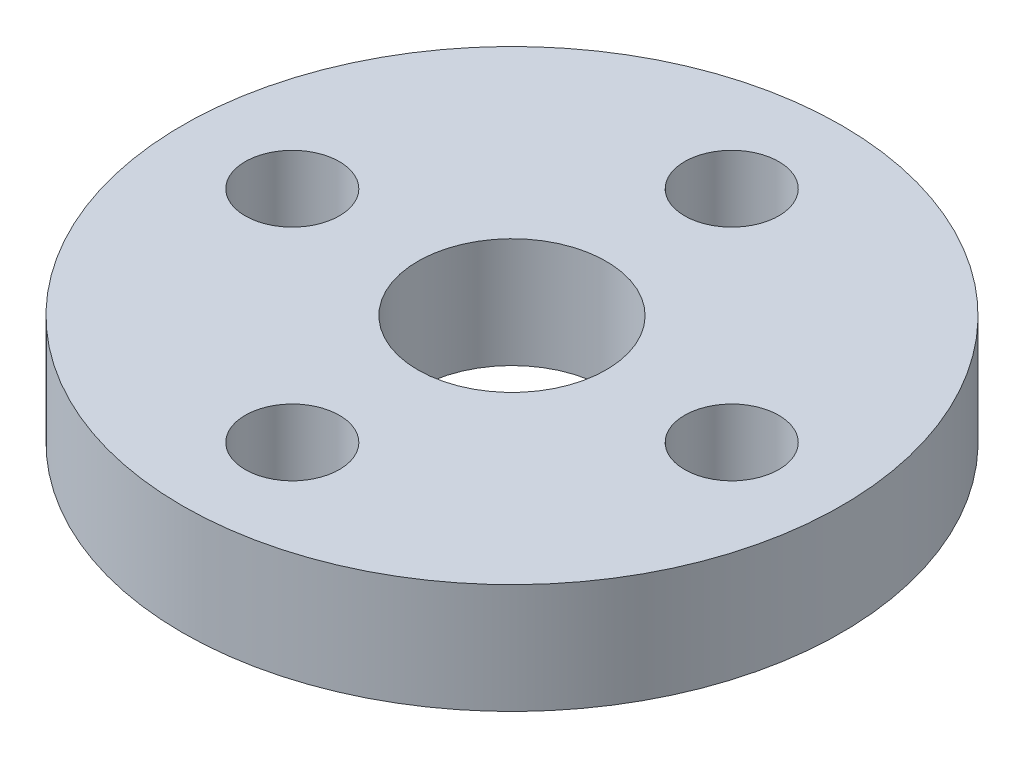
ISO-10303-21;
HEADER;
FILE_DESCRIPTION(('STEP AP214'),'2;1');
FILE_NAME('part.step','',(''),(''),'','','');
FILE_SCHEMA(('AUTOMOTIVE_DESIGN { 1 0 10303 214 1 1 1 1 }'));
ENDSEC;
DATA;
#1=APPLICATION_CONTEXT('core data for automotive mechanical design processes');
#2=APPLICATION_PROTOCOL_DEFINITION('international standard','automotive_design',2000,#1);
#3=PRODUCT_CONTEXT('',#1,'mechanical');
#4=PRODUCT('Part','Part','',(#3));
#5=PRODUCT_RELATED_PRODUCT_CATEGORY('part','',(#4));
#6=PRODUCT_DEFINITION_FORMATION('','',#4);
#7=PRODUCT_DEFINITION_CONTEXT('part definition',#1,'design');
#8=PRODUCT_DEFINITION('design','',#6,#7);
#9=PRODUCT_DEFINITION_SHAPE('','',#8);
#10=(LENGTH_UNIT() NAMED_UNIT(*) SI_UNIT(.MILLI.,.METRE.));
#11=(NAMED_UNIT(*) PLANE_ANGLE_UNIT() SI_UNIT($,.RADIAN.));
#12=(NAMED_UNIT(*) SI_UNIT($,.STERADIAN.) SOLID_ANGLE_UNIT());
#13=UNCERTAINTY_MEASURE_WITH_UNIT(LENGTH_MEASURE(1.E-05),#10,'distance_accuracy_value','');
#14=(GEOMETRIC_REPRESENTATION_CONTEXT(3) GLOBAL_UNCERTAINTY_ASSIGNED_CONTEXT((#13)) GLOBAL_UNIT_ASSIGNED_CONTEXT((#10,
#11,#12)) REPRESENTATION_CONTEXT('',''));
#15=CARTESIAN_POINT('',(0.,0.,0.));
#16=DIRECTION('',(0.,0.,1.));
#17=DIRECTION('',(1.,0.,0.));
#18=AXIS2_PLACEMENT_3D('',#15,#16,#17);
#19=CARTESIAN_POINT('',(0.,3.5,0.));
#20=DIRECTION('',(0.,-1.,0.));
#21=DIRECTION('',(0.,0.,-1.));
#22=AXIS2_PLACEMENT_3D('',#19,#20,#21);
#23=CYLINDRICAL_SURFACE('',#22,10.5);
#24=CARTESIAN_POINT('',(0.,3.5,0.));
#25=DIRECTION('',(0.,1.,0.));
#26=DIRECTION('',(0.,0.,1.));
#27=AXIS2_PLACEMENT_3D('',#24,#25,#26);
#28=CIRCLE('',#27,10.5);
#29=CARTESIAN_POINT('',(0.,3.5,-10.5));
#30=VERTEX_POINT('',#29);
#31=EDGE_CURVE('E10',#30,#30,#28,.T.);
#32=CARTESIAN_POINT('',(0.,0.,0.));
#33=DIRECTION('',(0.,1.,0.));
#34=DIRECTION('',(0.,0.,1.));
#35=AXIS2_PLACEMENT_3D('',#32,#33,#34);
#36=CIRCLE('',#35,10.5);
#37=CARTESIAN_POINT('',(0.,0.,-10.5));
#38=VERTEX_POINT('',#37);
#39=EDGE_CURVE('E42',#38,#38,#36,.T.);
#40=CARTESIAN_POINT('',(0.,3.5,-10.5));
#41=CARTESIAN_POINT('',(0.,3.46354166666667,-10.5));
#42=CARTESIAN_POINT('',(0.,3.42708333333333,-10.5));
#43=CARTESIAN_POINT('',(0.,3.35416666666667,-10.5));
#44=CARTESIAN_POINT('',(0.,3.31770833333333,-10.5));
#45=CARTESIAN_POINT('',(0.,3.24479166666667,-10.5));
#46=CARTESIAN_POINT('',(0.,3.20833333333333,-10.5));
#47=CARTESIAN_POINT('',(0.,3.13541666666667,-10.5));
#48=CARTESIAN_POINT('',(0.,3.09895833333333,-10.5));
#49=CARTESIAN_POINT('',(0.,3.02604166666667,-10.5));
#50=CARTESIAN_POINT('',(0.,2.98958333333333,-10.5));
#51=CARTESIAN_POINT('',(0.,2.91666666666667,-10.5));
#52=CARTESIAN_POINT('',(0.,2.88020833333333,-10.5));
#53=CARTESIAN_POINT('',(0.,2.80729166666667,-10.5));
#54=CARTESIAN_POINT('',(0.,2.77083333333333,-10.5));
#55=CARTESIAN_POINT('',(0.,2.69791666666667,-10.5));
#56=CARTESIAN_POINT('',(0.,2.66145833333333,-10.5));
#57=CARTESIAN_POINT('',(0.,2.58854166666667,-10.5));
#58=CARTESIAN_POINT('',(0.,2.55208333333333,-10.5));
#59=CARTESIAN_POINT('',(0.,2.47916666666667,-10.5));
#60=CARTESIAN_POINT('',(0.,2.44270833333333,-10.5));
#61=CARTESIAN_POINT('',(0.,2.36979166666667,-10.5));
#62=CARTESIAN_POINT('',(0.,2.33333333333333,-10.5));
#63=CARTESIAN_POINT('',(0.,2.26041666666667,-10.5));
#64=CARTESIAN_POINT('',(0.,2.22395833333333,-10.5));
#65=CARTESIAN_POINT('',(0.,2.15104166666667,-10.5));
#66=CARTESIAN_POINT('',(0.,2.11458333333333,-10.5));
#67=CARTESIAN_POINT('',(0.,2.04166666666667,-10.5));
#68=CARTESIAN_POINT('',(0.,2.00520833333333,-10.5));
#69=CARTESIAN_POINT('',(0.,1.93229166666667,-10.5));
#70=CARTESIAN_POINT('',(0.,1.89583333333333,-10.5));
#71=CARTESIAN_POINT('',(0.,1.82291666666667,-10.5));
#72=CARTESIAN_POINT('',(0.,1.78645833333333,-10.5));
#73=CARTESIAN_POINT('',(0.,1.71354166666667,-10.5));
#74=CARTESIAN_POINT('',(0.,1.67708333333333,-10.5));
#75=CARTESIAN_POINT('',(0.,1.60416666666667,-10.5));
#76=CARTESIAN_POINT('',(0.,1.56770833333333,-10.5));
#77=CARTESIAN_POINT('',(0.,1.49479166666667,-10.5));
#78=CARTESIAN_POINT('',(0.,1.45833333333333,-10.5));
#79=CARTESIAN_POINT('',(0.,1.38541666666667,-10.5));
#80=CARTESIAN_POINT('',(0.,1.34895833333333,-10.5));
#81=CARTESIAN_POINT('',(0.,1.27604166666667,-10.5));
#82=CARTESIAN_POINT('',(0.,1.23958333333333,-10.5));
#83=CARTESIAN_POINT('',(0.,1.16666666666667,-10.5));
#84=CARTESIAN_POINT('',(0.,1.13020833333333,-10.5));
#85=CARTESIAN_POINT('',(0.,1.05729166666667,-10.5));
#86=CARTESIAN_POINT('',(0.,1.02083333333333,-10.5));
#87=CARTESIAN_POINT('',(0.,0.947916666666666,-10.5));
#88=CARTESIAN_POINT('',(0.,0.911458333333333,-10.5));
#89=CARTESIAN_POINT('',(0.,0.838541666666666,-10.5));
#90=CARTESIAN_POINT('',(0.,0.802083333333333,-10.5));
#91=CARTESIAN_POINT('',(0.,0.729166666666667,-10.5));
#92=CARTESIAN_POINT('',(0.,0.692708333333333,-10.5));
#93=CARTESIAN_POINT('',(0.,0.619791666666666,-10.5));
#94=CARTESIAN_POINT('',(0.,0.583333333333333,-10.5));
#95=CARTESIAN_POINT('',(0.,0.510416666666666,-10.5));
#96=CARTESIAN_POINT('',(0.,0.473958333333333,-10.5));
#97=CARTESIAN_POINT('',(0.,0.401041666666666,-10.5));
#98=CARTESIAN_POINT('',(0.,0.364583333333333,-10.5));
#99=CARTESIAN_POINT('',(0.,0.291666666666666,-10.5));
#100=CARTESIAN_POINT('',(0.,0.255208333333333,-10.5));
#101=CARTESIAN_POINT('',(0.,0.182291666666666,-10.5));
#102=CARTESIAN_POINT('',(0.,0.145833333333333,-10.5));
#103=CARTESIAN_POINT('',(0.,0.0729166666666663,-10.5));
#104=CARTESIAN_POINT('',(0.,0.0364583333333329,-10.5));
#105=CARTESIAN_POINT('',(0.,0.,-10.5));
#106=B_SPLINE_CURVE_WITH_KNOTS('',3,(#40,#41,#42,#43,#44,#45,#46,#47,#48,#49,#50,#51,#52,#53,
#54,#55,#56,#57,#58,#59,#60,#61,#62,#63,#64,#65,#66,#67,#68,#69,#70,#71,#72,#73,#74,#75,#76,#77,
#78,#79,#80,#81,#82,#83,#84,#85,#86,#87,#88,#89,#90,#91,#92,#93,#94,#95,#96,#97,#98,#99,#100,
#101,#102,#103,#104,#105),.UNSPECIFIED.,.F.,.F.,(4,2,2,2,2,2,2,2,2,2,2,2,2,2,2,2,2,2,2,2,2,2,2,
2,2,2,2,2,2,2,2,2,4),(0.,0.109375,0.21875,0.328125,0.4375,0.546875,0.65625,0.765625,0.875,
0.984375,1.09375,1.203125,1.3125,1.421875,1.53125,1.640625,1.75,1.859375,1.96875,2.078125,
2.1875,2.296875,2.40625,2.515625,2.625,2.734375,2.84375,2.953125,3.0625,3.171875,3.28125,
3.390625,3.5),.UNSPECIFIED.);
#107=EDGE_CURVE('BSEAM35',#30,#38,#106,.T.);
#108=ORIENTED_EDGE('',*,*,#31,.F.);
#109=ORIENTED_EDGE('',*,*,#39,.T.);
#110=ORIENTED_EDGE('',*,*,#107,.T.);
#111=ORIENTED_EDGE('',*,*,#107,.F.);
#112=EDGE_LOOP('',(#108,#110,#109,#111));
#113=FACE_BOUND('',#112,.T.);
#114=ADVANCED_FACE('F35',(#113),#23,.T.);
#115=CARTESIAN_POINT('',(0.,3.5,0.));
#116=DIRECTION('',(0.,1.,0.));
#117=DIRECTION('',(0.,0.,1.));
#118=AXIS2_PLACEMENT_3D('',#115,#116,#117);
#119=PLANE('',#118);
#120=CARTESIAN_POINT('',(0.,3.5,-7.));
#121=DIRECTION('',(0.,1.,0.));
#122=DIRECTION('',(0.,0.,1.));
#123=AXIS2_PLACEMENT_3D('',#120,#121,#122);
#124=CIRCLE('',#123,1.5);
#125=CARTESIAN_POINT('',(0.,3.5,-5.5));
#126=VERTEX_POINT('',#125);
#127=EDGE_CURVE('E111',#126,#126,#124,.T.);
#128=ORIENTED_EDGE('',*,*,#127,.F.);
#129=EDGE_LOOP('',(#128));
#130=FACE_BOUND('',#129,.T.);
#131=CARTESIAN_POINT('',(7.0000000000002,3.5,-1.98094713253425E-13));
#132=DIRECTION('',(0.,1.,0.));
#133=DIRECTION('',(0.,0.,1.));
#134=AXIS2_PLACEMENT_3D('',#131,#132,#133);
#135=CIRCLE('',#134,1.50000000000015);
#136=CARTESIAN_POINT('',(7.0000000000002,3.5,1.49999999999996));
#137=VERTEX_POINT('',#136);
#138=EDGE_CURVE('E112',#137,#137,#135,.T.);
#139=ORIENTED_EDGE('',*,*,#138,.F.);
#140=EDGE_LOOP('',(#139));
#141=FACE_BOUND('',#140,.T.);
#142=CARTESIAN_POINT('',(3.9618942650685E-13,3.5,7.));
#143=DIRECTION('',(0.,1.,0.));
#144=DIRECTION('',(0.,0.,1.));
#145=AXIS2_PLACEMENT_3D('',#142,#143,#144);
#146=CIRCLE('',#145,1.50000000000043);
#147=CARTESIAN_POINT('',(3.9618942650685E-13,3.5,8.50000000000043));
#148=VERTEX_POINT('',#147);
#149=EDGE_CURVE('E116',#148,#148,#146,.T.);
#150=ORIENTED_EDGE('',*,*,#149,.F.);
#151=EDGE_LOOP('',(#150));
#152=FACE_BOUND('',#151,.T.);
#153=CARTESIAN_POINT('',(-6.9999999999998,3.5,1.98951966012828E-13));
#154=DIRECTION('',(0.,1.,0.));
#155=DIRECTION('',(0.,0.,1.));
#156=AXIS2_PLACEMENT_3D('',#153,#154,#155);
#157=CIRCLE('',#156,1.50000000000032);
#158=CARTESIAN_POINT('',(-6.9999999999998,3.5,1.50000000000052));
#159=VERTEX_POINT('',#158);
#160=EDGE_CURVE('E118',#159,#159,#157,.T.);
#161=ORIENTED_EDGE('',*,*,#160,.F.);
#162=EDGE_LOOP('',(#161));
#163=FACE_BOUND('',#162,.T.);
#164=CARTESIAN_POINT('',(0.,3.5,0.));
#165=DIRECTION('',(0.,1.,0.));
#166=DIRECTION('',(0.,0.,1.));
#167=AXIS2_PLACEMENT_3D('',#164,#165,#166);
#168=CIRCLE('',#167,3.);
#169=CARTESIAN_POINT('',(0.,3.5,3.));
#170=VERTEX_POINT('',#169);
#171=EDGE_CURVE('E49',#170,#170,#168,.T.);
#172=ORIENTED_EDGE('',*,*,#171,.F.);
#173=EDGE_LOOP('',(#172));
#174=FACE_BOUND('',#173,.T.);
#175=ORIENTED_EDGE('',*,*,#31,.T.);
#176=EDGE_LOOP('',(#175));
#177=FACE_BOUND('',#176,.T.);
#178=ADVANCED_FACE('F83',(#130,#141,#152,#163,#174,#177),#119,.T.);
#179=CARTESIAN_POINT('',(0.,0.,0.));
#180=DIRECTION('',(0.,1.,0.));
#181=DIRECTION('',(0.,0.,1.));
#182=AXIS2_PLACEMENT_3D('',#179,#180,#181);
#183=PLANE('',#182);
#184=CARTESIAN_POINT('',(0.,0.,-7.));
#185=DIRECTION('',(0.,1.,0.));
#186=DIRECTION('',(0.,0.,1.));
#187=AXIS2_PLACEMENT_3D('',#184,#185,#186);
#188=CIRCLE('',#187,1.5);
#189=CARTESIAN_POINT('',(0.,0.,-5.5));
#190=VERTEX_POINT('',#189);
#191=EDGE_CURVE('E38',#190,#190,#188,.T.);
#192=ORIENTED_EDGE('',*,*,#191,.T.);
#193=EDGE_LOOP('',(#192));
#194=FACE_BOUND('',#193,.T.);
#195=CARTESIAN_POINT('',(7.0000000000002,0.,-1.98094713253425E-13));
#196=DIRECTION('',(0.,1.,0.));
#197=DIRECTION('',(0.,0.,1.));
#198=AXIS2_PLACEMENT_3D('',#195,#196,#197);
#199=CIRCLE('',#198,1.50000000000015);
#200=CARTESIAN_POINT('',(7.0000000000002,0.,1.49999999999996));
#201=VERTEX_POINT('',#200);
#202=EDGE_CURVE('E60',#201,#201,#199,.T.);
#203=ORIENTED_EDGE('',*,*,#202,.T.);
#204=EDGE_LOOP('',(#203));
#205=FACE_BOUND('',#204,.T.);
#206=CARTESIAN_POINT('',(3.9618942650685E-13,0.,7.));
#207=DIRECTION('',(0.,1.,0.));
#208=DIRECTION('',(0.,0.,1.));
#209=AXIS2_PLACEMENT_3D('',#206,#207,#208);
#210=CIRCLE('',#209,1.50000000000043);
#211=CARTESIAN_POINT('',(3.9618942650685E-13,0.,8.50000000000043));
#212=VERTEX_POINT('',#211);
#213=EDGE_CURVE('E58',#212,#212,#210,.T.);
#214=ORIENTED_EDGE('',*,*,#213,.T.);
#215=EDGE_LOOP('',(#214));
#216=FACE_BOUND('',#215,.T.);
#217=CARTESIAN_POINT('',(-6.9999999999998,0.,1.98951966012828E-13));
#218=DIRECTION('',(0.,1.,0.));
#219=DIRECTION('',(0.,0.,1.));
#220=AXIS2_PLACEMENT_3D('',#217,#218,#219);
#221=CIRCLE('',#220,1.50000000000032);
#222=CARTESIAN_POINT('',(-6.9999999999998,0.,1.50000000000052));
#223=VERTEX_POINT('',#222);
#224=EDGE_CURVE('E55',#223,#223,#221,.T.);
#225=ORIENTED_EDGE('',*,*,#224,.T.);
#226=EDGE_LOOP('',(#225));
#227=FACE_BOUND('',#226,.T.);
#228=CARTESIAN_POINT('',(0.,0.,0.));
#229=DIRECTION('',(0.,1.,0.));
#230=DIRECTION('',(0.,0.,1.));
#231=AXIS2_PLACEMENT_3D('',#228,#229,#230);
#232=CIRCLE('',#231,3.);
#233=CARTESIAN_POINT('',(0.,0.,3.));
#234=VERTEX_POINT('',#233);
#235=EDGE_CURVE('E52',#234,#234,#232,.T.);
#236=ORIENTED_EDGE('',*,*,#235,.T.);
#237=EDGE_LOOP('',(#236));
#238=FACE_BOUND('',#237,.T.);
#239=ORIENTED_EDGE('',*,*,#39,.F.);
#240=EDGE_LOOP('',(#239));
#241=FACE_BOUND('',#240,.T.);
#242=ADVANCED_FACE('F67',(#194,#205,#216,#227,#238,#241),#183,.F.);
#243=CARTESIAN_POINT('',(0.,-6.7,0.));
#244=DIRECTION('',(0.,1.,0.));
#245=DIRECTION('',(0.,0.,1.));
#246=AXIS2_PLACEMENT_3D('',#243,#244,#245);
#247=CYLINDRICAL_SURFACE('',#246,3.);
#248=ORIENTED_EDGE('',*,*,#171,.T.);
#249=EDGE_LOOP('',(#248));
#250=FACE_BOUND('',#249,.T.);
#251=ORIENTED_EDGE('',*,*,#235,.F.);
#252=EDGE_LOOP('',(#251));
#253=FACE_BOUND('',#252,.T.);
#254=ADVANCED_FACE('F94',(#250,#253),#247,.F.);
#255=CARTESIAN_POINT('',(-6.9999999999998,-6.7,1.98951966012828E-13));
#256=DIRECTION('',(0.,1.,0.));
#257=DIRECTION('',(0.,0.,1.));
#258=AXIS2_PLACEMENT_3D('',#255,#256,#257);
#259=CYLINDRICAL_SURFACE('',#258,1.50000000000032);
#260=ORIENTED_EDGE('',*,*,#160,.T.);
#261=EDGE_LOOP('',(#260));
#262=FACE_BOUND('',#261,.T.);
#263=ORIENTED_EDGE('',*,*,#224,.F.);
#264=EDGE_LOOP('',(#263));
#265=FACE_BOUND('',#264,.T.);
#266=ADVANCED_FACE('F98',(#262,#265),#259,.F.);
#267=CARTESIAN_POINT('',(3.9618942650685E-13,-6.7,7.));
#268=DIRECTION('',(0.,1.,0.));
#269=DIRECTION('',(0.,0.,1.));
#270=AXIS2_PLACEMENT_3D('',#267,#268,#269);
#271=CYLINDRICAL_SURFACE('',#270,1.50000000000043);
#272=ORIENTED_EDGE('',*,*,#149,.T.);
#273=EDGE_LOOP('',(#272));
#274=FACE_BOUND('',#273,.T.);
#275=ORIENTED_EDGE('',*,*,#213,.F.);
#276=EDGE_LOOP('',(#275));
#277=FACE_BOUND('',#276,.T.);
#278=ADVANCED_FACE('F77',(#274,#277),#271,.F.);
#279=CARTESIAN_POINT('',(7.0000000000002,-6.7,-1.98094713253425E-13));
#280=DIRECTION('',(0.,1.,0.));
#281=DIRECTION('',(0.,0.,1.));
#282=AXIS2_PLACEMENT_3D('',#279,#280,#281);
#283=CYLINDRICAL_SURFACE('',#282,1.50000000000015);
#284=ORIENTED_EDGE('',*,*,#138,.T.);
#285=EDGE_LOOP('',(#284));
#286=FACE_BOUND('',#285,.T.);
#287=ORIENTED_EDGE('',*,*,#202,.F.);
#288=EDGE_LOOP('',(#287));
#289=FACE_BOUND('',#288,.T.);
#290=ADVANCED_FACE('F71',(#286,#289),#283,.F.);
#291=CARTESIAN_POINT('',(0.,-6.7,-7.));
#292=DIRECTION('',(0.,1.,0.));
#293=DIRECTION('',(0.,0.,1.));
#294=AXIS2_PLACEMENT_3D('',#291,#292,#293);
#295=CYLINDRICAL_SURFACE('',#294,1.5);
#296=ORIENTED_EDGE('',*,*,#127,.T.);
#297=EDGE_LOOP('',(#296));
#298=FACE_BOUND('',#297,.T.);
#299=ORIENTED_EDGE('',*,*,#191,.F.);
#300=EDGE_LOOP('',(#299));
#301=FACE_BOUND('',#300,.T.);
#302=ADVANCED_FACE('F69',(#298,#301),#295,.F.);
#303=CLOSED_SHELL('',(#114,#178,#242,#254,#266,#278,#290,#302));
#304=MANIFOLD_SOLID_BREP('B2',#303);
#305=ADVANCED_BREP_SHAPE_REPRESENTATION('',(#18,#304),#14);
#306=SHAPE_DEFINITION_REPRESENTATION(#9,#305);
ENDSEC;
END-ISO-10303-21;
